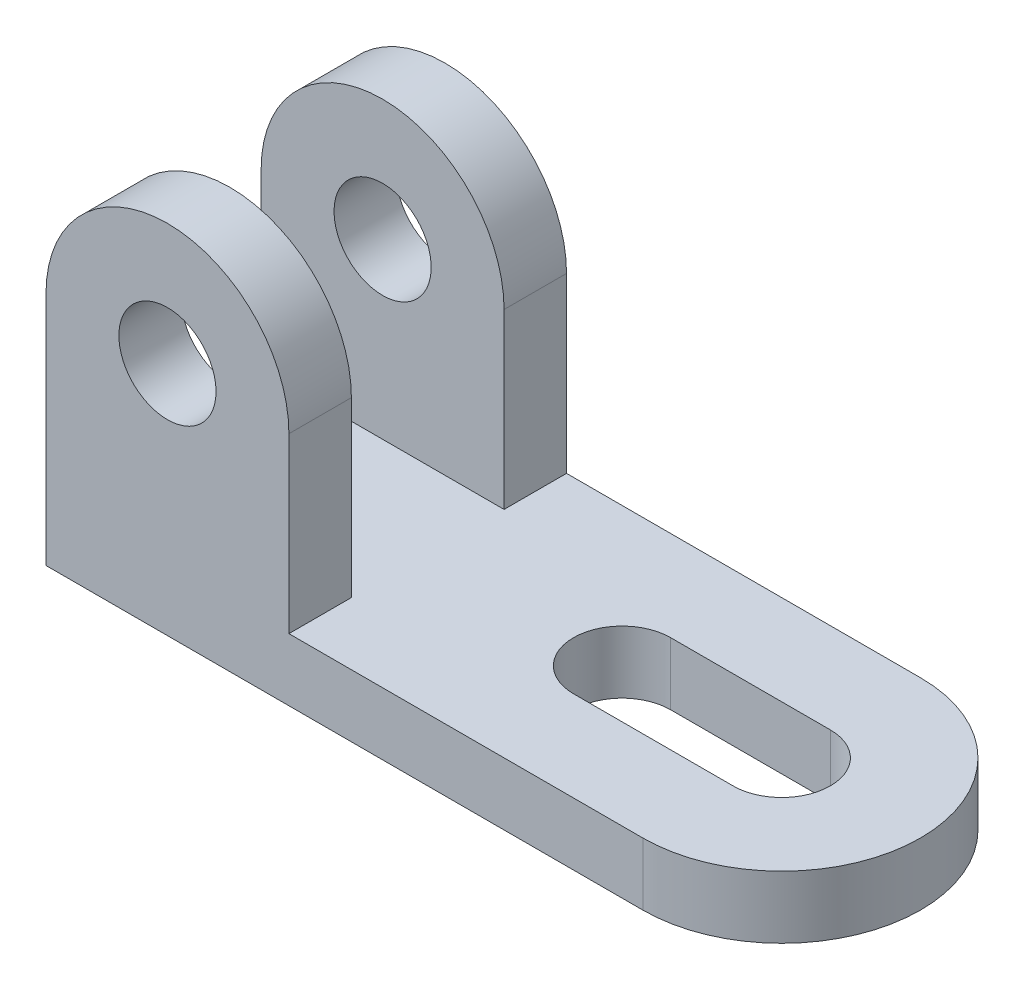
ISO-10303-21;
HEADER;
FILE_DESCRIPTION(('STEP AP214'),'2;1');
FILE_NAME('part.step','',(''),(''),'','','');
FILE_SCHEMA(('AUTOMOTIVE_DESIGN { 1 0 10303 214 1 1 1 1 }'));
ENDSEC;
DATA;
#1=APPLICATION_CONTEXT('core data for automotive mechanical design processes');
#2=APPLICATION_PROTOCOL_DEFINITION('international standard','automotive_design',2000,#1);
#3=PRODUCT_CONTEXT('',#1,'mechanical');
#4=PRODUCT('Part','Part','',(#3));
#5=PRODUCT_RELATED_PRODUCT_CATEGORY('part','',(#4));
#6=PRODUCT_DEFINITION_FORMATION('','',#4);
#7=PRODUCT_DEFINITION_CONTEXT('part definition',#1,'design');
#8=PRODUCT_DEFINITION('design','',#6,#7);
#9=PRODUCT_DEFINITION_SHAPE('','',#8);
#10=(LENGTH_UNIT() NAMED_UNIT(*) SI_UNIT(.MILLI.,.METRE.));
#11=(NAMED_UNIT(*) PLANE_ANGLE_UNIT() SI_UNIT($,.RADIAN.));
#12=(NAMED_UNIT(*) SI_UNIT($,.STERADIAN.) SOLID_ANGLE_UNIT());
#13=UNCERTAINTY_MEASURE_WITH_UNIT(LENGTH_MEASURE(1.E-05),#10,'distance_accuracy_value','');
#14=(GEOMETRIC_REPRESENTATION_CONTEXT(3) GLOBAL_UNCERTAINTY_ASSIGNED_CONTEXT((#13)) GLOBAL_UNIT_ASSIGNED_CONTEXT((#10,
#11,#12)) REPRESENTATION_CONTEXT('',''));
#15=CARTESIAN_POINT('',(0.,0.,0.));
#16=DIRECTION('',(0.,0.,1.));
#17=DIRECTION('',(1.,0.,0.));
#18=AXIS2_PLACEMENT_3D('',#15,#16,#17);
#19=CARTESIAN_POINT('',(0.,9.,-20.));
#20=DIRECTION('',(0.,0.,-1.));
#21=DIRECTION('',(-1.,0.,0.));
#22=AXIS2_PLACEMENT_3D('',#19,#20,#21);
#23=PLANE('',#22);
#24=CARTESIAN_POINT('',(-80.5511339507543,33.94768948089,-20.));
#25=DIRECTION('',(0.,0.,-1.));
#26=DIRECTION('',(-1.,0.,0.));
#27=AXIS2_PLACEMENT_3D('',#24,#25,#26);
#28=CIRCLE('',#27,7.);
#29=CARTESIAN_POINT('',(-87.5511339507543,33.94768948089,-20.));
#30=VERTEX_POINT('',#29);
#31=EDGE_CURVE('E189',#30,#30,#28,.T.);
#32=ORIENTED_EDGE('',*,*,#31,.F.);
#33=EDGE_LOOP('',(#32));
#34=FACE_BOUND('',#33,.T.);
#35=DIRECTION('',(0.,-1.,0.));
#36=VECTOR('',#35,1.);
#37=CARTESIAN_POINT('',(-98.0511339507543,55.5,-20.));
#38=LINE('',#37,#36);
#39=CARTESIAN_POINT('',(-98.0511339507543,33.94768948089,-20.));
#40=VERTEX_POINT('',#39);
#41=CARTESIAN_POINT('',(-98.0511339507543,0.,-20.));
#42=VERTEX_POINT('',#41);
#43=EDGE_CURVE('E190',#40,#42,#38,.T.);
#44=ORIENTED_EDGE('',*,*,#43,.F.);
#45=CARTESIAN_POINT('',(-80.5511339507543,33.94768948089,-20.));
#46=DIRECTION('',(0.,0.,-1.));
#47=DIRECTION('',(-1.,0.,0.));
#48=AXIS2_PLACEMENT_3D('',#45,#46,#47);
#49=CIRCLE('',#48,17.5);
#50=CARTESIAN_POINT('',(-63.0511339507543,33.94768948089,-20.));
#51=VERTEX_POINT('',#50);
#52=EDGE_CURVE('E322',#40,#51,#49,.T.);
#53=ORIENTED_EDGE('',*,*,#52,.T.);
#54=DIRECTION('',(0.,-1.,0.));
#55=VECTOR('',#54,1.);
#56=CARTESIAN_POINT('',(-63.0511339507543,55.5,-20.));
#57=LINE('',#56,#55);
#58=CARTESIAN_POINT('',(-63.0511339507543,9.,-20.));
#59=VERTEX_POINT('',#58);
#60=EDGE_CURVE('E188',#51,#59,#57,.T.);
#61=ORIENTED_EDGE('',*,*,#60,.T.);
#62=DIRECTION('',(1.,0.,0.));
#63=VECTOR('',#62,1.);
#64=CARTESIAN_POINT('',(0.,9.,-20.));
#65=LINE('',#64,#63);
#66=CARTESIAN_POINT('',(-12.0511339507543,9.,-20.));
#67=VERTEX_POINT('',#66);
#68=EDGE_CURVE('E208',#59,#67,#65,.T.);
#69=ORIENTED_EDGE('',*,*,#68,.T.);
#70=DIRECTION('',(0.,-1.,0.));
#71=VECTOR('',#70,1.);
#72=CARTESIAN_POINT('',(-12.0511339507543,9.,-20.));
#73=LINE('',#72,#71);
#74=CARTESIAN_POINT('',(-12.0511339507543,0.,-20.));
#75=VERTEX_POINT('',#74);
#76=EDGE_CURVE('E250',#67,#75,#73,.T.);
#77=ORIENTED_EDGE('',*,*,#76,.T.);
#78=DIRECTION('',(1.,0.,0.));
#79=VECTOR('',#78,1.);
#80=CARTESIAN_POINT('',(0.,0.,-20.));
#81=LINE('',#80,#79);
#82=EDGE_CURVE('E244',#42,#75,#81,.T.);
#83=ORIENTED_EDGE('',*,*,#82,.F.);
#84=EDGE_LOOP('',(#44,#53,#61,#69,#77,#83));
#85=FACE_BOUND('',#84,.T.);
#86=ADVANCED_FACE('F53',(#34,#85),#23,.T.);
#87=CARTESIAN_POINT('',(-98.0511339507543,9.,0.));
#88=DIRECTION('',(1.,0.,0.));
#89=DIRECTION('',(0.,0.,-1.));
#90=AXIS2_PLACEMENT_3D('',#87,#88,#89);
#91=PLANE('',#90);
#92=DIRECTION('',(0.,0.,1.));
#93=VECTOR('',#92,1.);
#94=CARTESIAN_POINT('',(-98.0511339507543,33.94768948089,-35.5));
#95=LINE('',#94,#93);
#96=CARTESIAN_POINT('',(-98.0511339507543,33.94768948089,-11.));
#97=VERTEX_POINT('',#96);
#98=EDGE_CURVE('E75',#40,#97,#95,.T.);
#99=ORIENTED_EDGE('',*,*,#98,.F.);
#100=ORIENTED_EDGE('',*,*,#43,.T.);
#101=DIRECTION('',(0.,0.,1.));
#102=VECTOR('',#101,1.);
#103=CARTESIAN_POINT('',(-98.0511339507543,0.,0.));
#104=LINE('',#103,#102);
#105=CARTESIAN_POINT('',(-98.0511339507543,0.,20.));
#106=VERTEX_POINT('',#105);
#107=EDGE_CURVE('E197',#42,#106,#104,.T.);
#108=ORIENTED_EDGE('',*,*,#107,.T.);
#109=DIRECTION('',(0.,-1.,0.));
#110=VECTOR('',#109,1.);
#111=CARTESIAN_POINT('',(-98.0511339507543,55.5,20.));
#112=LINE('',#111,#110);
#113=CARTESIAN_POINT('',(-98.0511339507543,33.94768948089,20.));
#114=VERTEX_POINT('',#113);
#115=EDGE_CURVE('E173',#114,#106,#112,.T.);
#116=ORIENTED_EDGE('',*,*,#115,.F.);
#117=CARTESIAN_POINT('',(-98.0511339507543,33.94768948089,11.));
#118=VERTEX_POINT('',#117);
#119=EDGE_CURVE('E160',#118,#114,#95,.T.);
#120=ORIENTED_EDGE('',*,*,#119,.F.);
#121=DIRECTION('',(0.,-1.,0.));
#122=VECTOR('',#121,1.);
#123=CARTESIAN_POINT('',(-98.0511339507543,55.5,11.));
#124=LINE('',#123,#122);
#125=CARTESIAN_POINT('',(-98.0511339507543,9.,11.));
#126=VERTEX_POINT('',#125);
#127=EDGE_CURVE('E179',#118,#126,#124,.T.);
#128=ORIENTED_EDGE('',*,*,#127,.T.);
#129=DIRECTION('',(0.,0.,1.));
#130=VECTOR('',#129,1.);
#131=CARTESIAN_POINT('',(-98.0511339507543,9.,0.));
#132=LINE('',#131,#130);
#133=CARTESIAN_POINT('',(-98.0511339507543,9.,-11.));
#134=VERTEX_POINT('',#133);
#135=EDGE_CURVE('E220',#134,#126,#132,.T.);
#136=ORIENTED_EDGE('',*,*,#135,.F.);
#137=DIRECTION('',(0.,-1.,0.));
#138=VECTOR('',#137,1.);
#139=CARTESIAN_POINT('',(-98.0511339507543,55.5,-11.));
#140=LINE('',#139,#138);
#141=EDGE_CURVE('E183',#97,#134,#140,.T.);
#142=ORIENTED_EDGE('',*,*,#141,.F.);
#143=EDGE_LOOP('',(#99,#100,#108,#116,#120,#128,#136,#142));
#144=FACE_BOUND('',#143,.T.);
#145=ADVANCED_FACE('F290',(#144),#91,.F.);
#146=CARTESIAN_POINT('',(0.,55.5,-11.));
#147=DIRECTION('',(0.,0.,-1.));
#148=DIRECTION('',(-1.,0.,0.));
#149=AXIS2_PLACEMENT_3D('',#146,#147,#148);
#150=PLANE('',#149);
#151=CARTESIAN_POINT('',(-80.5511339507543,33.94768948089,-11.));
#152=DIRECTION('',(0.,0.,-1.));
#153=DIRECTION('',(-1.,0.,0.));
#154=AXIS2_PLACEMENT_3D('',#151,#152,#153);
#155=CIRCLE('',#154,7.);
#156=CARTESIAN_POINT('',(-87.5511339507543,33.94768948089,-11.));
#157=VERTEX_POINT('',#156);
#158=EDGE_CURVE('E330',#157,#157,#155,.T.);
#159=ORIENTED_EDGE('',*,*,#158,.T.);
#160=EDGE_LOOP('',(#159));
#161=FACE_BOUND('',#160,.T.);
#162=CARTESIAN_POINT('',(-80.5511339507543,33.94768948089,-11.));
#163=DIRECTION('',(0.,0.,-1.));
#164=DIRECTION('',(-1.,0.,0.));
#165=AXIS2_PLACEMENT_3D('',#162,#163,#164);
#166=CIRCLE('',#165,17.5);
#167=CARTESIAN_POINT('',(-63.0511339507543,33.94768948089,-11.));
#168=VERTEX_POINT('',#167);
#169=EDGE_CURVE('E325',#97,#168,#166,.T.);
#170=ORIENTED_EDGE('',*,*,#169,.F.);
#171=ORIENTED_EDGE('',*,*,#141,.T.);
#172=DIRECTION('',(1.,0.,0.));
#173=VECTOR('',#172,1.);
#174=CARTESIAN_POINT('',(0.,9.,-11.));
#175=LINE('',#174,#173);
#176=CARTESIAN_POINT('',(-63.0511339507543,9.,-11.));
#177=VERTEX_POINT('',#176);
#178=EDGE_CURVE('E212',#134,#177,#175,.T.);
#179=ORIENTED_EDGE('',*,*,#178,.T.);
#180=DIRECTION('',(0.,-1.,0.));
#181=VECTOR('',#180,1.);
#182=CARTESIAN_POINT('',(-63.0511339507543,55.5,-11.));
#183=LINE('',#182,#181);
#184=EDGE_CURVE('E176',#168,#177,#183,.T.);
#185=ORIENTED_EDGE('',*,*,#184,.F.);
#186=EDGE_LOOP('',(#170,#171,#179,#185));
#187=FACE_BOUND('',#186,.T.);
#188=ADVANCED_FACE('F293',(#161,#187),#150,.F.);
#189=CARTESIAN_POINT('',(0.,55.5,11.));
#190=DIRECTION('',(0.,0.,-1.));
#191=DIRECTION('',(-1.,0.,0.));
#192=AXIS2_PLACEMENT_3D('',#189,#190,#191);
#193=PLANE('',#192);
#194=CARTESIAN_POINT('',(-80.5511339507543,33.94768948089,11.));
#195=DIRECTION('',(0.,0.,-1.));
#196=DIRECTION('',(-1.,0.,0.));
#197=AXIS2_PLACEMENT_3D('',#194,#195,#196);
#198=CIRCLE('',#197,7.);
#199=CARTESIAN_POINT('',(-87.5511339507543,33.94768948089,11.));
#200=VERTEX_POINT('',#199);
#201=EDGE_CURVE('E59',#200,#200,#198,.T.);
#202=ORIENTED_EDGE('',*,*,#201,.F.);
#203=EDGE_LOOP('',(#202));
#204=FACE_BOUND('',#203,.T.);
#205=ORIENTED_EDGE('',*,*,#127,.F.);
#206=CARTESIAN_POINT('',(-80.5511339507543,33.94768948089,11.));
#207=DIRECTION('',(0.,0.,-1.));
#208=DIRECTION('',(-1.,0.,0.));
#209=AXIS2_PLACEMENT_3D('',#206,#207,#208);
#210=CIRCLE('',#209,17.5);
#211=CARTESIAN_POINT('',(-63.0511339507543,33.94768948089,11.));
#212=VERTEX_POINT('',#211);
#213=EDGE_CURVE('E319',#118,#212,#210,.T.);
#214=ORIENTED_EDGE('',*,*,#213,.T.);
#215=DIRECTION('',(0.,-1.,0.));
#216=VECTOR('',#215,1.);
#217=CARTESIAN_POINT('',(-63.0511339507543,55.5,11.));
#218=LINE('',#217,#216);
#219=CARTESIAN_POINT('',(-63.0511339507543,9.,11.));
#220=VERTEX_POINT('',#219);
#221=EDGE_CURVE('E166',#212,#220,#218,.T.);
#222=ORIENTED_EDGE('',*,*,#221,.T.);
#223=DIRECTION('',(1.,0.,0.));
#224=VECTOR('',#223,1.);
#225=CARTESIAN_POINT('',(0.,9.,11.));
#226=LINE('',#225,#224);
#227=EDGE_CURVE('E219',#126,#220,#226,.T.);
#228=ORIENTED_EDGE('',*,*,#227,.F.);
#229=EDGE_LOOP('',(#205,#214,#222,#228));
#230=FACE_BOUND('',#229,.T.);
#231=ADVANCED_FACE('F313',(#204,#230),#193,.T.);
#232=CARTESIAN_POINT('',(-63.0511339507543,55.5,0.));
#233=DIRECTION('',(1.,0.,0.));
#234=DIRECTION('',(0.,0.,-1.));
#235=AXIS2_PLACEMENT_3D('',#232,#233,#234);
#236=PLANE('',#235);
#237=ORIENTED_EDGE('',*,*,#221,.F.);
#238=DIRECTION('',(0.,0.,1.));
#239=VECTOR('',#238,1.);
#240=CARTESIAN_POINT('',(-63.0511339507543,33.94768948089,-35.5));
#241=LINE('',#240,#239);
#242=CARTESIAN_POINT('',(-63.0511339507543,33.94768948089,20.));
#243=VERTEX_POINT('',#242);
#244=EDGE_CURVE('E12',#212,#243,#241,.T.);
#245=ORIENTED_EDGE('',*,*,#244,.T.);
#246=DIRECTION('',(0.,-1.,0.));
#247=VECTOR('',#246,1.);
#248=CARTESIAN_POINT('',(-63.0511339507543,55.5,20.));
#249=LINE('',#248,#247);
#250=CARTESIAN_POINT('',(-63.0511339507543,9.,20.));
#251=VERTEX_POINT('',#250);
#252=EDGE_CURVE('E170',#243,#251,#249,.T.);
#253=ORIENTED_EDGE('',*,*,#252,.T.);
#254=DIRECTION('',(0.,0.,1.));
#255=VECTOR('',#254,1.);
#256=CARTESIAN_POINT('',(-63.0511339507543,9.,0.));
#257=LINE('',#256,#255);
#258=EDGE_CURVE('E224',#220,#251,#257,.T.);
#259=ORIENTED_EDGE('',*,*,#258,.F.);
#260=EDGE_LOOP('',(#237,#245,#253,#259));
#261=FACE_BOUND('',#260,.T.);
#262=ADVANCED_FACE('F164',(#261),#236,.T.);
#263=CARTESIAN_POINT('',(0.,9.,20.));
#264=DIRECTION('',(0.,0.,-1.));
#265=DIRECTION('',(-1.,0.,0.));
#266=AXIS2_PLACEMENT_3D('',#263,#264,#265);
#267=PLANE('',#266);
#268=CARTESIAN_POINT('',(-80.5511339507543,33.94768948089,20.));
#269=DIRECTION('',(0.,0.,1.));
#270=DIRECTION('',(1.,0.,0.));
#271=AXIS2_PLACEMENT_3D('',#268,#269,#270);
#272=CIRCLE('',#271,7.);
#273=CARTESIAN_POINT('',(-73.5511339507543,33.94768948089,20.));
#274=VERTEX_POINT('',#273);
#275=EDGE_CURVE('E161',#274,#274,#272,.T.);
#276=ORIENTED_EDGE('',*,*,#275,.F.);
#277=EDGE_LOOP('',(#276));
#278=FACE_BOUND('',#277,.T.);
#279=ORIENTED_EDGE('',*,*,#252,.F.);
#280=CARTESIAN_POINT('',(-80.5511339507543,33.94768948089,20.));
#281=DIRECTION('',(0.,0.,1.));
#282=DIRECTION('',(1.,0.,0.));
#283=AXIS2_PLACEMENT_3D('',#280,#281,#282);
#284=CIRCLE('',#283,17.5);
#285=EDGE_CURVE('E152',#243,#114,#284,.T.);
#286=ORIENTED_EDGE('',*,*,#285,.T.);
#287=ORIENTED_EDGE('',*,*,#115,.T.);
#288=DIRECTION('',(1.,0.,0.));
#289=VECTOR('',#288,1.);
#290=CARTESIAN_POINT('',(0.,0.,20.));
#291=LINE('',#290,#289);
#292=CARTESIAN_POINT('',(-12.0511339507543,0.,20.));
#293=VERTEX_POINT('',#292);
#294=EDGE_CURVE('E240',#106,#293,#291,.T.);
#295=ORIENTED_EDGE('',*,*,#294,.T.);
#296=DIRECTION('',(0.,-1.,0.));
#297=VECTOR('',#296,1.);
#298=CARTESIAN_POINT('',(-12.0511339507543,9.,20.));
#299=LINE('',#298,#297);
#300=CARTESIAN_POINT('',(-12.0511339507543,9.,20.));
#301=VERTEX_POINT('',#300);
#302=EDGE_CURVE('E64',#301,#293,#299,.T.);
#303=ORIENTED_EDGE('',*,*,#302,.F.);
#304=DIRECTION('',(1.,0.,0.));
#305=VECTOR('',#304,1.);
#306=CARTESIAN_POINT('',(0.,9.,20.));
#307=LINE('',#306,#305);
#308=EDGE_CURVE('E171',#251,#301,#307,.T.);
#309=ORIENTED_EDGE('',*,*,#308,.F.);
#310=EDGE_LOOP('',(#279,#286,#287,#295,#303,#309));
#311=FACE_BOUND('',#310,.T.);
#312=ADVANCED_FACE('F172',(#278,#311),#267,.F.);
#313=CARTESIAN_POINT('',(-12.0511339507543,9.,0.));
#314=DIRECTION('',(0.,-1.,0.));
#315=DIRECTION('',(0.,0.,-1.));
#316=AXIS2_PLACEMENT_3D('',#313,#314,#315);
#317=CYLINDRICAL_SURFACE('',#316,20.);
#318=CARTESIAN_POINT('',(-12.0511339507543,0.,0.));
#319=DIRECTION('',(0.,1.,0.));
#320=DIRECTION('',(0.,0.,1.));
#321=AXIS2_PLACEMENT_3D('',#318,#319,#320);
#322=CIRCLE('',#321,20.);
#323=EDGE_CURVE('E238',#293,#75,#322,.T.);
#324=ORIENTED_EDGE('',*,*,#323,.T.);
#325=ORIENTED_EDGE('',*,*,#76,.F.);
#326=CARTESIAN_POINT('',(-12.0511339507543,9.,0.));
#327=DIRECTION('',(0.,1.,0.));
#328=DIRECTION('',(0.,0.,1.));
#329=AXIS2_PLACEMENT_3D('',#326,#327,#328);
#330=CIRCLE('',#329,20.);
#331=EDGE_CURVE('E206',#301,#67,#330,.T.);
#332=ORIENTED_EDGE('',*,*,#331,.F.);
#333=ORIENTED_EDGE('',*,*,#302,.T.);
#334=EDGE_LOOP('',(#324,#325,#332,#333));
#335=FACE_BOUND('',#334,.T.);
#336=ADVANCED_FACE('F304',(#335),#317,.T.);
#337=CARTESIAN_POINT('',(-35.0511339507543,9.,0.));
#338=DIRECTION('',(0.,-1.,0.));
#339=DIRECTION('',(0.,0.,-1.));
#340=AXIS2_PLACEMENT_3D('',#337,#338,#339);
#341=CYLINDRICAL_SURFACE('',#340,7.);
#342=CARTESIAN_POINT('',(-35.0511339507543,0.,0.));
#343=DIRECTION('',(0.,1.,0.));
#344=DIRECTION('',(0.,0.,1.));
#345=AXIS2_PLACEMENT_3D('',#342,#343,#344);
#346=CIRCLE('',#345,7.);
#347=CARTESIAN_POINT('',(-35.0511339507543,0.,-7.));
#348=VERTEX_POINT('',#347);
#349=CARTESIAN_POINT('',(-35.0511339507543,0.,7.));
#350=VERTEX_POINT('',#349);
#351=EDGE_CURVE('E184',#348,#350,#346,.T.);
#352=ORIENTED_EDGE('',*,*,#351,.F.);
#353=DIRECTION('',(0.,-1.,0.));
#354=VECTOR('',#353,1.);
#355=CARTESIAN_POINT('',(-35.0511339507543,9.,-7.));
#356=LINE('',#355,#354);
#357=CARTESIAN_POINT('',(-35.0511339507543,9.,-7.));
#358=VERTEX_POINT('',#357);
#359=EDGE_CURVE('E248',#358,#348,#356,.T.);
#360=ORIENTED_EDGE('',*,*,#359,.F.);
#361=CARTESIAN_POINT('',(-35.0511339507543,9.,0.));
#362=DIRECTION('',(0.,1.,0.));
#363=DIRECTION('',(0.,0.,1.));
#364=AXIS2_PLACEMENT_3D('',#361,#362,#363);
#365=CIRCLE('',#364,7.);
#366=CARTESIAN_POINT('',(-35.0511339507543,9.,7.));
#367=VERTEX_POINT('',#366);
#368=EDGE_CURVE('E195',#358,#367,#365,.T.);
#369=ORIENTED_EDGE('',*,*,#368,.T.);
#370=DIRECTION('',(0.,-1.,0.));
#371=VECTOR('',#370,1.);
#372=CARTESIAN_POINT('',(-35.0511339507543,9.,7.));
#373=LINE('',#372,#371);
#374=EDGE_CURVE('E223',#367,#350,#373,.T.);
#375=ORIENTED_EDGE('',*,*,#374,.T.);
#376=EDGE_LOOP('',(#352,#360,#369,#375));
#377=FACE_BOUND('',#376,.T.);
#378=ADVANCED_FACE('F57',(#377),#341,.F.);
#379=CARTESIAN_POINT('',(0.,9.,-7.));
#380=DIRECTION('',(0.,0.,1.));
#381=DIRECTION('',(1.,0.,0.));
#382=AXIS2_PLACEMENT_3D('',#379,#380,#381);
#383=PLANE('',#382);
#384=DIRECTION('',(-1.,0.,0.));
#385=VECTOR('',#384,1.);
#386=CARTESIAN_POINT('',(0.,0.,-7.));
#387=LINE('',#386,#385);
#388=CARTESIAN_POINT('',(-12.0511339507543,0.,-7.));
#389=VERTEX_POINT('',#388);
#390=EDGE_CURVE('E229',#389,#348,#387,.T.);
#391=ORIENTED_EDGE('',*,*,#390,.F.);
#392=DIRECTION('',(0.,-1.,0.));
#393=VECTOR('',#392,1.);
#394=CARTESIAN_POINT('',(-12.0511339507543,9.,-7.));
#395=LINE('',#394,#393);
#396=CARTESIAN_POINT('',(-12.0511339507543,9.,-7.));
#397=VERTEX_POINT('',#396);
#398=EDGE_CURVE('E258',#397,#389,#395,.T.);
#399=ORIENTED_EDGE('',*,*,#398,.F.);
#400=DIRECTION('',(-1.,0.,0.));
#401=VECTOR('',#400,1.);
#402=CARTESIAN_POINT('',(0.,9.,-7.));
#403=LINE('',#402,#401);
#404=EDGE_CURVE('E198',#397,#358,#403,.T.);
#405=ORIENTED_EDGE('',*,*,#404,.T.);
#406=ORIENTED_EDGE('',*,*,#359,.T.);
#407=EDGE_LOOP('',(#391,#399,#405,#406));
#408=FACE_BOUND('',#407,.T.);
#409=ADVANCED_FACE('F257',(#408),#383,.T.);
#410=CARTESIAN_POINT('',(-12.0511339507543,9.,0.));
#411=DIRECTION('',(0.,-1.,0.));
#412=DIRECTION('',(0.,0.,-1.));
#413=AXIS2_PLACEMENT_3D('',#410,#411,#412);
#414=CYLINDRICAL_SURFACE('',#413,7.);
#415=CARTESIAN_POINT('',(-12.0511339507543,0.,0.));
#416=DIRECTION('',(0.,1.,0.));
#417=DIRECTION('',(0.,0.,1.));
#418=AXIS2_PLACEMENT_3D('',#415,#416,#417);
#419=CIRCLE('',#418,7.);
#420=CARTESIAN_POINT('',(-12.0511339507543,0.,7.));
#421=VERTEX_POINT('',#420);
#422=EDGE_CURVE('E232',#421,#389,#419,.T.);
#423=ORIENTED_EDGE('',*,*,#422,.F.);
#424=DIRECTION('',(0.,-1.,0.));
#425=VECTOR('',#424,1.);
#426=CARTESIAN_POINT('',(-12.0511339507543,9.,7.));
#427=LINE('',#426,#425);
#428=CARTESIAN_POINT('',(-12.0511339507543,9.,7.));
#429=VERTEX_POINT('',#428);
#430=EDGE_CURVE('E255',#429,#421,#427,.T.);
#431=ORIENTED_EDGE('',*,*,#430,.F.);
#432=CARTESIAN_POINT('',(-12.0511339507543,9.,0.));
#433=DIRECTION('',(0.,1.,0.));
#434=DIRECTION('',(0.,0.,1.));
#435=AXIS2_PLACEMENT_3D('',#432,#433,#434);
#436=CIRCLE('',#435,7.);
#437=EDGE_CURVE('E199',#429,#397,#436,.T.);
#438=ORIENTED_EDGE('',*,*,#437,.T.);
#439=ORIENTED_EDGE('',*,*,#398,.T.);
#440=EDGE_LOOP('',(#423,#431,#438,#439));
#441=FACE_BOUND('',#440,.T.);
#442=ADVANCED_FACE('F269',(#441),#414,.F.);
#443=CARTESIAN_POINT('',(0.,9.,7.));
#444=DIRECTION('',(0.,0.,1.));
#445=DIRECTION('',(1.,0.,0.));
#446=AXIS2_PLACEMENT_3D('',#443,#444,#445);
#447=PLANE('',#446);
#448=DIRECTION('',(-1.,0.,0.));
#449=VECTOR('',#448,1.);
#450=CARTESIAN_POINT('',(0.,0.,7.));
#451=LINE('',#450,#449);
#452=EDGE_CURVE('E231',#421,#350,#451,.T.);
#453=ORIENTED_EDGE('',*,*,#452,.T.);
#454=ORIENTED_EDGE('',*,*,#374,.F.);
#455=DIRECTION('',(-1.,0.,0.));
#456=VECTOR('',#455,1.);
#457=CARTESIAN_POINT('',(0.,9.,7.));
#458=LINE('',#457,#456);
#459=EDGE_CURVE('E201',#429,#367,#458,.T.);
#460=ORIENTED_EDGE('',*,*,#459,.F.);
#461=ORIENTED_EDGE('',*,*,#430,.T.);
#462=EDGE_LOOP('',(#453,#454,#460,#461));
#463=FACE_BOUND('',#462,.T.);
#464=ADVANCED_FACE('F280',(#463),#447,.F.);
#465=CARTESIAN_POINT('',(0.,9.,0.));
#466=DIRECTION('',(0.,1.,0.));
#467=DIRECTION('',(0.,0.,1.));
#468=AXIS2_PLACEMENT_3D('',#465,#466,#467);
#469=PLANE('',#468);
#470=ORIENTED_EDGE('',*,*,#368,.F.);
#471=ORIENTED_EDGE('',*,*,#404,.F.);
#472=ORIENTED_EDGE('',*,*,#437,.F.);
#473=ORIENTED_EDGE('',*,*,#459,.T.);
#474=EDGE_LOOP('',(#470,#471,#472,#473));
#475=FACE_BOUND('',#474,.T.);
#476=ORIENTED_EDGE('',*,*,#308,.T.);
#477=ORIENTED_EDGE('',*,*,#331,.T.);
#478=ORIENTED_EDGE('',*,*,#68,.F.);
#479=DIRECTION('',(0.,0.,-1.));
#480=VECTOR('',#479,1.);
#481=CARTESIAN_POINT('',(-63.0511339507543,9.,0.));
#482=LINE('',#481,#480);
#483=EDGE_CURVE('E211',#177,#59,#482,.T.);
#484=ORIENTED_EDGE('',*,*,#483,.F.);
#485=ORIENTED_EDGE('',*,*,#178,.F.);
#486=ORIENTED_EDGE('',*,*,#135,.T.);
#487=ORIENTED_EDGE('',*,*,#227,.T.);
#488=ORIENTED_EDGE('',*,*,#258,.T.);
#489=EDGE_LOOP('',(#476,#477,#478,#484,#485,#486,#487,#488));
#490=FACE_BOUND('',#489,.T.);
#491=ADVANCED_FACE('F273',(#475,#490),#469,.T.);
#492=CARTESIAN_POINT('',(0.,0.,0.));
#493=DIRECTION('',(0.,1.,0.));
#494=DIRECTION('',(0.,0.,1.));
#495=AXIS2_PLACEMENT_3D('',#492,#493,#494);
#496=PLANE('',#495);
#497=ORIENTED_EDGE('',*,*,#107,.F.);
#498=ORIENTED_EDGE('',*,*,#82,.T.);
#499=ORIENTED_EDGE('',*,*,#323,.F.);
#500=ORIENTED_EDGE('',*,*,#294,.F.);
#501=EDGE_LOOP('',(#497,#498,#499,#500));
#502=FACE_BOUND('',#501,.T.);
#503=ORIENTED_EDGE('',*,*,#351,.T.);
#504=ORIENTED_EDGE('',*,*,#452,.F.);
#505=ORIENTED_EDGE('',*,*,#422,.T.);
#506=ORIENTED_EDGE('',*,*,#390,.T.);
#507=EDGE_LOOP('',(#503,#504,#505,#506));
#508=FACE_BOUND('',#507,.T.);
#509=ADVANCED_FACE('F270',(#502,#508),#496,.F.);
#510=CARTESIAN_POINT('',(-63.0511339507543,55.5,0.));
#511=DIRECTION('',(-1.,0.,0.));
#512=DIRECTION('',(0.,0.,1.));
#513=AXIS2_PLACEMENT_3D('',#510,#511,#512);
#514=PLANE('',#513);
#515=ORIENTED_EDGE('',*,*,#60,.F.);
#516=EDGE_CURVE('E63',#51,#168,#241,.T.);
#517=ORIENTED_EDGE('',*,*,#516,.T.);
#518=ORIENTED_EDGE('',*,*,#184,.T.);
#519=ORIENTED_EDGE('',*,*,#483,.T.);
#520=EDGE_LOOP('',(#515,#517,#518,#519));
#521=FACE_BOUND('',#520,.T.);
#522=ADVANCED_FACE('F354',(#521),#514,.F.);
#523=CARTESIAN_POINT('',(-80.5511339507543,33.94768948089,-35.5));
#524=DIRECTION('',(0.,0.,1.));
#525=DIRECTION('',(1.,0.,0.));
#526=AXIS2_PLACEMENT_3D('',#523,#524,#525);
#527=CYLINDRICAL_SURFACE('',#526,17.5);
#528=ORIENTED_EDGE('',*,*,#119,.T.);
#529=ORIENTED_EDGE('',*,*,#285,.F.);
#530=ORIENTED_EDGE('',*,*,#244,.F.);
#531=ORIENTED_EDGE('',*,*,#213,.F.);
#532=EDGE_LOOP('',(#528,#529,#530,#531));
#533=FACE_BOUND('',#532,.T.);
#534=ADVANCED_FACE('F154',(#533),#527,.T.);
#535=CARTESIAN_POINT('',(-80.5511339507543,33.94768948089,-35.5));
#536=DIRECTION('',(0.,0.,1.));
#537=DIRECTION('',(1.,0.,0.));
#538=AXIS2_PLACEMENT_3D('',#535,#536,#537);
#539=CYLINDRICAL_SURFACE('',#538,7.);
#540=ORIENTED_EDGE('',*,*,#201,.T.);
#541=EDGE_LOOP('',(#540));
#542=FACE_BOUND('',#541,.T.);
#543=ORIENTED_EDGE('',*,*,#275,.T.);
#544=EDGE_LOOP('',(#543));
#545=FACE_BOUND('',#544,.T.);
#546=ADVANCED_FACE('F337',(#542,#545),#539,.F.);
#547=ORIENTED_EDGE('',*,*,#98,.T.);
#548=ORIENTED_EDGE('',*,*,#169,.T.);
#549=ORIENTED_EDGE('',*,*,#516,.F.);
#550=ORIENTED_EDGE('',*,*,#52,.F.);
#551=EDGE_LOOP('',(#547,#548,#549,#550));
#552=FACE_BOUND('',#551,.T.);
#553=ADVANCED_FACE('F331',(#552),#527,.T.);
#554=ORIENTED_EDGE('',*,*,#31,.T.);
#555=EDGE_LOOP('',(#554));
#556=FACE_BOUND('',#555,.T.);
#557=ORIENTED_EDGE('',*,*,#158,.F.);
#558=EDGE_LOOP('',(#557));
#559=FACE_BOUND('',#558,.T.);
#560=ADVANCED_FACE('F332',(#556,#559),#539,.F.);
#561=CLOSED_SHELL('',(#86,#145,#188,#231,#262,#312,#336,#378,#409,#442,#464,#491,#509,#522,#534,
#546,#553,#560));
#562=MANIFOLD_SOLID_BREP('B2',#561);
#563=ADVANCED_BREP_SHAPE_REPRESENTATION('',(#18,#562),#14);
#564=SHAPE_DEFINITION_REPRESENTATION(#9,#563);
ENDSEC;
END-ISO-10303-21;
